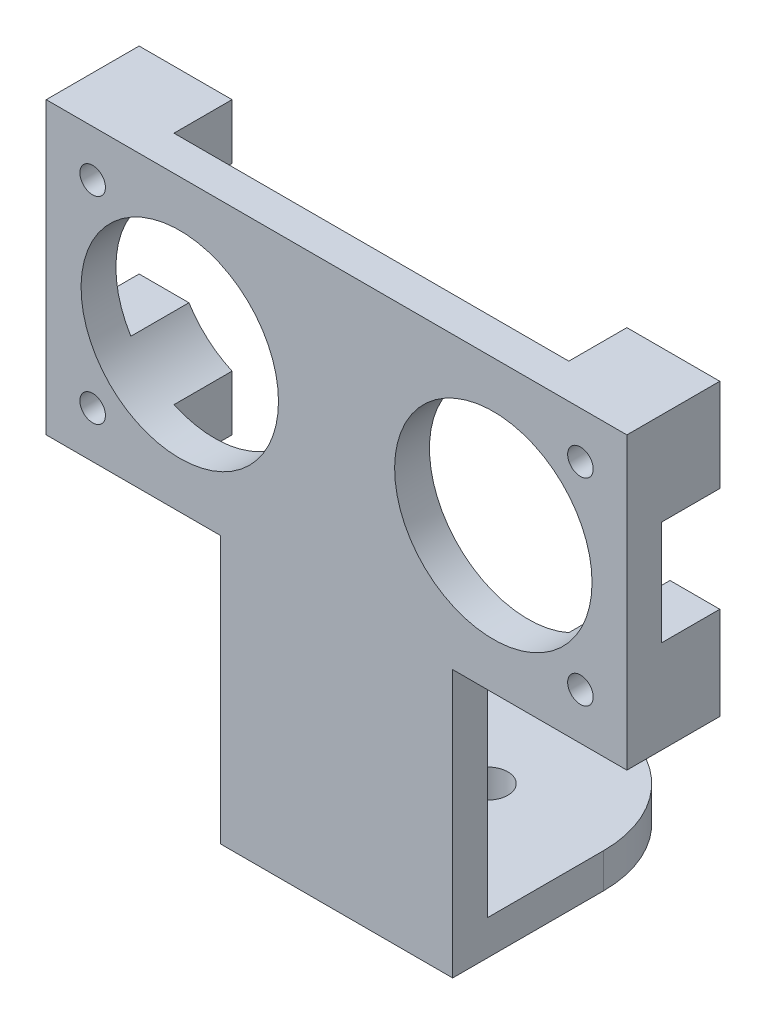
ISO-10303-21;
HEADER;
FILE_DESCRIPTION(('STEP AP214'),'2;1');
FILE_NAME('part.step','',(''),(''),'','','');
FILE_SCHEMA(('AUTOMOTIVE_DESIGN { 1 0 10303 214 1 1 1 1 }'));
ENDSEC;
DATA;
#1=APPLICATION_CONTEXT('core data for automotive mechanical design processes');
#2=APPLICATION_PROTOCOL_DEFINITION('international standard','automotive_design',2000,#1);
#3=PRODUCT_CONTEXT('',#1,'mechanical');
#4=PRODUCT('Part','Part','',(#3));
#5=PRODUCT_RELATED_PRODUCT_CATEGORY('part','',(#4));
#6=PRODUCT_DEFINITION_FORMATION('','',#4);
#7=PRODUCT_DEFINITION_CONTEXT('part definition',#1,'design');
#8=PRODUCT_DEFINITION('design','',#6,#7);
#9=PRODUCT_DEFINITION_SHAPE('','',#8);
#10=(LENGTH_UNIT() NAMED_UNIT(*) SI_UNIT(.MILLI.,.METRE.));
#11=(NAMED_UNIT(*) PLANE_ANGLE_UNIT() SI_UNIT($,.RADIAN.));
#12=(NAMED_UNIT(*) SI_UNIT($,.STERADIAN.) SOLID_ANGLE_UNIT());
#13=UNCERTAINTY_MEASURE_WITH_UNIT(LENGTH_MEASURE(1.E-05),#10,'distance_accuracy_value','');
#14=(GEOMETRIC_REPRESENTATION_CONTEXT(3) GLOBAL_UNCERTAINTY_ASSIGNED_CONTEXT((#13)) GLOBAL_UNIT_ASSIGNED_CONTEXT((#10,
#11,#12)) REPRESENTATION_CONTEXT('',''));
#15=CARTESIAN_POINT('',(0.,0.,0.));
#16=DIRECTION('',(0.,0.,1.));
#17=DIRECTION('',(1.,0.,0.));
#18=AXIS2_PLACEMENT_3D('',#15,#16,#17);
#19=CARTESIAN_POINT('',(0.,0.,0.));
#20=DIRECTION('',(0.,0.,-1.));
#21=DIRECTION('',(-1.,0.,0.));
#22=AXIS2_PLACEMENT_3D('',#19,#20,#21);
#23=PLANE('',#22);
#24=DIRECTION('',(1.,0.,0.));
#25=VECTOR('',#24,1.);
#26=CARTESIAN_POINT('',(-25.,-12.5,0.));
#27=LINE('',#26,#25);
#28=CARTESIAN_POINT('',(-17.,-12.5,0.));
#29=VERTEX_POINT('',#28);
#30=CARTESIAN_POINT('',(-9.99999999999999,-12.5,0.));
#31=VERTEX_POINT('',#30);
#32=EDGE_CURVE('E58',#29,#31,#27,.T.);
#33=ORIENTED_EDGE('',*,*,#32,.F.);
#34=DIRECTION('',(0.,-1.,0.));
#35=VECTOR('',#34,1.);
#36=CARTESIAN_POINT('',(-17.,-12.5,0.));
#37=LINE('',#36,#35);
#38=CARTESIAN_POINT('',(-17.,-7.74596669241484,0.));
#39=VERTEX_POINT('',#38);
#40=EDGE_CURVE('E779',#39,#29,#37,.T.);
#41=ORIENTED_EDGE('',*,*,#40,.F.);
#42=CARTESIAN_POINT('',(-13.5,0.,0.));
#43=DIRECTION('',(0.,0.,1.));
#44=DIRECTION('',(1.,0.,0.));
#45=AXIS2_PLACEMENT_3D('',#42,#43,#44);
#46=CIRCLE('',#45,8.5);
#47=CARTESIAN_POINT('',(-17.,7.74596669241483,0.));
#48=VERTEX_POINT('',#47);
#49=EDGE_CURVE('E232',#39,#48,#46,.T.);
#50=ORIENTED_EDGE('',*,*,#49,.T.);
#51=DIRECTION('',(0.,-1.,0.));
#52=VECTOR('',#51,1.);
#53=CARTESIAN_POINT('',(-17.,12.5,0.));
#54=LINE('',#53,#52);
#55=CARTESIAN_POINT('',(-17.,12.5,0.));
#56=VERTEX_POINT('',#55);
#57=EDGE_CURVE('E312',#56,#48,#54,.T.);
#58=ORIENTED_EDGE('',*,*,#57,.F.);
#59=DIRECTION('',(-1.,0.,0.));
#60=VECTOR('',#59,1.);
#61=CARTESIAN_POINT('',(-25.,12.5,0.));
#62=LINE('',#61,#60);
#63=CARTESIAN_POINT('',(17.,12.5,0.));
#64=VERTEX_POINT('',#63);
#65=EDGE_CURVE('E410',#64,#56,#62,.T.);
#66=ORIENTED_EDGE('',*,*,#65,.F.);
#67=DIRECTION('',(0.,1.,0.));
#68=VECTOR('',#67,1.);
#69=CARTESIAN_POINT('',(17.,12.5,0.));
#70=LINE('',#69,#68);
#71=CARTESIAN_POINT('',(17.,7.74596669241483,0.));
#72=VERTEX_POINT('',#71);
#73=EDGE_CURVE('E274',#72,#64,#70,.T.);
#74=ORIENTED_EDGE('',*,*,#73,.F.);
#75=CARTESIAN_POINT('',(13.5,0.,0.));
#76=DIRECTION('',(0.,0.,1.));
#77=DIRECTION('',(1.,0.,0.));
#78=AXIS2_PLACEMENT_3D('',#75,#76,#77);
#79=CIRCLE('',#78,8.5);
#80=CARTESIAN_POINT('',(17.,-7.74596669241483,0.));
#81=VERTEX_POINT('',#80);
#82=EDGE_CURVE('E381',#72,#81,#79,.T.);
#83=ORIENTED_EDGE('',*,*,#82,.T.);
#84=DIRECTION('',(0.,1.,0.));
#85=VECTOR('',#84,1.);
#86=CARTESIAN_POINT('',(17.,-12.5,0.));
#87=LINE('',#86,#85);
#88=CARTESIAN_POINT('',(17.,-12.5,0.));
#89=VERTEX_POINT('',#88);
#90=EDGE_CURVE('E246',#89,#81,#87,.T.);
#91=ORIENTED_EDGE('',*,*,#90,.F.);
#92=DIRECTION('',(1.,0.,0.));
#93=VECTOR('',#92,1.);
#94=CARTESIAN_POINT('',(10.,-12.5,0.));
#95=LINE('',#94,#93);
#96=CARTESIAN_POINT('',(10.,-12.5,0.));
#97=VERTEX_POINT('',#96);
#98=EDGE_CURVE('E386',#97,#89,#95,.T.);
#99=ORIENTED_EDGE('',*,*,#98,.F.);
#100=DIRECTION('',(0.,1.,0.));
#101=VECTOR('',#100,1.);
#102=CARTESIAN_POINT('',(10.,-32.5,0.));
#103=LINE('',#102,#101);
#104=CARTESIAN_POINT('',(9.99999999999998,-32.5,0.));
#105=VERTEX_POINT('',#104);
#106=EDGE_CURVE('E393',#105,#97,#103,.T.);
#107=ORIENTED_EDGE('',*,*,#106,.F.);
#108=DIRECTION('',(1.,0.,0.));
#109=VECTOR('',#108,1.);
#110=CARTESIAN_POINT('',(-10.,-32.5,0.));
#111=LINE('',#110,#109);
#112=CARTESIAN_POINT('',(-10.,-32.5,0.));
#113=VERTEX_POINT('',#112);
#114=EDGE_CURVE('E417',#113,#105,#111,.T.);
#115=ORIENTED_EDGE('',*,*,#114,.F.);
#116=DIRECTION('',(0.,-1.,0.));
#117=VECTOR('',#116,1.);
#118=CARTESIAN_POINT('',(-9.99999999999999,-12.5,0.));
#119=LINE('',#118,#117);
#120=EDGE_CURVE('E415',#31,#113,#119,.T.);
#121=ORIENTED_EDGE('',*,*,#120,.F.);
#122=EDGE_LOOP('',(#33,#41,#50,#58,#66,#74,#83,#91,#99,#107,#115,#121));
#123=FACE_BOUND('',#122,.T.);
#124=ADVANCED_FACE('F35',(#123),#23,.T.);
#125=CARTESIAN_POINT('',(-20.711102550928,4.5,0.));
#126=VERTEX_POINT('',#125);
#127=CARTESIAN_POINT('',(-20.711102550928,-4.5,0.));
#128=VERTEX_POINT('',#127);
#129=EDGE_CURVE('E387',#126,#128,#46,.T.);
#130=ORIENTED_EDGE('',*,*,#129,.T.);
#131=DIRECTION('',(1.,0.,0.));
#132=VECTOR('',#131,1.);
#133=CARTESIAN_POINT('',(-25.,-4.5,0.));
#134=LINE('',#133,#132);
#135=CARTESIAN_POINT('',(-25.,-4.49999999999999,0.));
#136=VERTEX_POINT('',#135);
#137=EDGE_CURVE('E50',#136,#128,#134,.T.);
#138=ORIENTED_EDGE('',*,*,#137,.F.);
#139=DIRECTION('',(0.,-1.,0.));
#140=VECTOR('',#139,1.);
#141=CARTESIAN_POINT('',(-25.,12.5,0.));
#142=LINE('',#141,#140);
#143=CARTESIAN_POINT('',(-25.,4.5,0.));
#144=VERTEX_POINT('',#143);
#145=EDGE_CURVE('E412',#144,#136,#142,.T.);
#146=ORIENTED_EDGE('',*,*,#145,.F.);
#147=DIRECTION('',(-1.,0.,0.));
#148=VECTOR('',#147,1.);
#149=CARTESIAN_POINT('',(-25.,4.5,0.));
#150=LINE('',#149,#148);
#151=EDGE_CURVE('E307',#126,#144,#150,.T.);
#152=ORIENTED_EDGE('',*,*,#151,.F.);
#153=EDGE_LOOP('',(#130,#138,#146,#152));
#154=FACE_BOUND('',#153,.T.);
#155=ADVANCED_FACE('F501',(#154),#23,.T.);
#156=DIRECTION('',(0.,1.,0.));
#157=VECTOR('',#156,1.);
#158=CARTESIAN_POINT('',(25.,12.5,0.));
#159=LINE('',#158,#157);
#160=CARTESIAN_POINT('',(25.,-4.5,0.));
#161=VERTEX_POINT('',#160);
#162=CARTESIAN_POINT('',(25.,4.5,0.));
#163=VERTEX_POINT('',#162);
#164=EDGE_CURVE('E408',#161,#163,#159,.T.);
#165=ORIENTED_EDGE('',*,*,#164,.F.);
#166=DIRECTION('',(1.,0.,0.));
#167=VECTOR('',#166,1.);
#168=CARTESIAN_POINT('',(25.,-4.5,0.));
#169=LINE('',#168,#167);
#170=CARTESIAN_POINT('',(20.711102550928,-4.5,0.));
#171=VERTEX_POINT('',#170);
#172=EDGE_CURVE('E236',#171,#161,#169,.T.);
#173=ORIENTED_EDGE('',*,*,#172,.F.);
#174=CARTESIAN_POINT('',(20.711102550928,4.5,0.));
#175=VERTEX_POINT('',#174);
#176=EDGE_CURVE('E377',#171,#175,#79,.T.);
#177=ORIENTED_EDGE('',*,*,#176,.T.);
#178=DIRECTION('',(-1.,0.,0.));
#179=VECTOR('',#178,1.);
#180=CARTESIAN_POINT('',(25.,4.5,0.));
#181=LINE('',#180,#179);
#182=EDGE_CURVE('E279',#163,#175,#181,.T.);
#183=ORIENTED_EDGE('',*,*,#182,.F.);
#184=EDGE_LOOP('',(#165,#173,#177,#183));
#185=FACE_BOUND('',#184,.T.);
#186=ADVANCED_FACE('F499',(#185),#23,.T.);
#187=CARTESIAN_POINT('',(0.,0.,3.));
#188=DIRECTION('',(0.,0.,-1.));
#189=DIRECTION('',(-1.,0.,0.));
#190=AXIS2_PLACEMENT_3D('',#187,#188,#189);
#191=PLANE('',#190);
#192=DIRECTION('',(1.,0.,0.));
#193=VECTOR('',#192,1.);
#194=CARTESIAN_POINT('',(10.,-12.5,3.));
#195=LINE('',#194,#193);
#196=CARTESIAN_POINT('',(10.,-12.5,3.));
#197=VERTEX_POINT('',#196);
#198=CARTESIAN_POINT('',(25.,-12.5,3.));
#199=VERTEX_POINT('',#198);
#200=EDGE_CURVE('E389',#197,#199,#195,.T.);
#201=ORIENTED_EDGE('',*,*,#200,.T.);
#202=DIRECTION('',(0.,1.,0.));
#203=VECTOR('',#202,1.);
#204=CARTESIAN_POINT('',(25.,12.5,3.));
#205=LINE('',#204,#203);
#206=CARTESIAN_POINT('',(25.,12.5,3.));
#207=VERTEX_POINT('',#206);
#208=EDGE_CURVE('E392',#199,#207,#205,.T.);
#209=ORIENTED_EDGE('',*,*,#208,.T.);
#210=DIRECTION('',(-1.,0.,0.));
#211=VECTOR('',#210,1.);
#212=CARTESIAN_POINT('',(-25.,12.5,3.));
#213=LINE('',#212,#211);
#214=CARTESIAN_POINT('',(-25.,12.5,3.));
#215=VERTEX_POINT('',#214);
#216=EDGE_CURVE('E395',#207,#215,#213,.T.);
#217=ORIENTED_EDGE('',*,*,#216,.T.);
#218=DIRECTION('',(0.,-1.,0.));
#219=VECTOR('',#218,1.);
#220=CARTESIAN_POINT('',(-25.,12.5,3.));
#221=LINE('',#220,#219);
#222=CARTESIAN_POINT('',(-25.,-12.5,3.));
#223=VERTEX_POINT('',#222);
#224=EDGE_CURVE('E397',#215,#223,#221,.T.);
#225=ORIENTED_EDGE('',*,*,#224,.T.);
#226=DIRECTION('',(1.,0.,0.));
#227=VECTOR('',#226,1.);
#228=CARTESIAN_POINT('',(-25.,-12.5,3.));
#229=LINE('',#228,#227);
#230=CARTESIAN_POINT('',(-9.99999999999999,-12.5,3.));
#231=VERTEX_POINT('',#230);
#232=EDGE_CURVE('E399',#223,#231,#229,.T.);
#233=ORIENTED_EDGE('',*,*,#232,.T.);
#234=DIRECTION('',(0.,-1.,0.));
#235=VECTOR('',#234,1.);
#236=CARTESIAN_POINT('',(-9.99999999999999,-12.5,3.));
#237=LINE('',#236,#235);
#238=CARTESIAN_POINT('',(-9.99999999999999,-35.5,3.));
#239=VERTEX_POINT('',#238);
#240=EDGE_CURVE('E401',#231,#239,#237,.T.);
#241=ORIENTED_EDGE('',*,*,#240,.T.);
#242=DIRECTION('',(-1.,0.,0.));
#243=VECTOR('',#242,1.);
#244=CARTESIAN_POINT('',(-9.99999999999999,-35.5,3.));
#245=LINE('',#244,#243);
#246=CARTESIAN_POINT('',(9.99999999999998,-35.5,3.));
#247=VERTEX_POINT('',#246);
#248=EDGE_CURVE('E343',#247,#239,#245,.T.);
#249=ORIENTED_EDGE('',*,*,#248,.F.);
#250=DIRECTION('',(0.,1.,0.));
#251=VECTOR('',#250,1.);
#252=CARTESIAN_POINT('',(10.,-32.5,3.));
#253=LINE('',#252,#251);
#254=EDGE_CURVE('E403',#247,#197,#253,.T.);
#255=ORIENTED_EDGE('',*,*,#254,.T.);
#256=EDGE_LOOP('',(#201,#209,#217,#225,#233,#241,#249,#255));
#257=FACE_BOUND('',#256,.T.);
#258=CARTESIAN_POINT('',(-13.5,0.,3.));
#259=DIRECTION('',(0.,0.,1.));
#260=DIRECTION('',(1.,0.,0.));
#261=AXIS2_PLACEMENT_3D('',#258,#259,#260);
#262=CIRCLE('',#261,8.5);
#263=CARTESIAN_POINT('',(-4.99999999999999,0.,3.));
#264=VERTEX_POINT('',#263);
#265=EDGE_CURVE('E383',#264,#264,#262,.T.);
#266=ORIENTED_EDGE('',*,*,#265,.F.);
#267=EDGE_LOOP('',(#266));
#268=FACE_BOUND('',#267,.T.);
#269=CARTESIAN_POINT('',(13.5,0.,3.));
#270=DIRECTION('',(0.,0.,1.));
#271=DIRECTION('',(1.,0.,0.));
#272=AXIS2_PLACEMENT_3D('',#269,#270,#271);
#273=CIRCLE('',#272,8.5);
#274=CARTESIAN_POINT('',(22.,0.,3.));
#275=VERTEX_POINT('',#274);
#276=EDGE_CURVE('E378',#275,#275,#273,.T.);
#277=ORIENTED_EDGE('',*,*,#276,.F.);
#278=EDGE_LOOP('',(#277));
#279=FACE_BOUND('',#278,.T.);
#280=CARTESIAN_POINT('',(-21.,8.5,3.));
#281=DIRECTION('',(0.,0.,1.));
#282=DIRECTION('',(1.,0.,0.));
#283=AXIS2_PLACEMENT_3D('',#280,#281,#282);
#284=CIRCLE('',#283,1.1);
#285=CARTESIAN_POINT('',(-19.9,8.5,3.));
#286=VERTEX_POINT('',#285);
#287=EDGE_CURVE('E374',#286,#286,#284,.T.);
#288=ORIENTED_EDGE('',*,*,#287,.F.);
#289=EDGE_LOOP('',(#288));
#290=FACE_BOUND('',#289,.T.);
#291=CARTESIAN_POINT('',(21.,8.5,3.));
#292=DIRECTION('',(0.,0.,1.));
#293=DIRECTION('',(1.,0.,0.));
#294=AXIS2_PLACEMENT_3D('',#291,#292,#293);
#295=CIRCLE('',#294,1.1);
#296=CARTESIAN_POINT('',(22.1,8.5,3.));
#297=VERTEX_POINT('',#296);
#298=EDGE_CURVE('E371',#297,#297,#295,.T.);
#299=ORIENTED_EDGE('',*,*,#298,.F.);
#300=EDGE_LOOP('',(#299));
#301=FACE_BOUND('',#300,.T.);
#302=CARTESIAN_POINT('',(21.,-8.5,3.));
#303=DIRECTION('',(0.,0.,1.));
#304=DIRECTION('',(1.,0.,0.));
#305=AXIS2_PLACEMENT_3D('',#302,#303,#304);
#306=CIRCLE('',#305,1.1);
#307=CARTESIAN_POINT('',(22.1,-8.5,3.));
#308=VERTEX_POINT('',#307);
#309=EDGE_CURVE('E368',#308,#308,#306,.T.);
#310=ORIENTED_EDGE('',*,*,#309,.F.);
#311=EDGE_LOOP('',(#310));
#312=FACE_BOUND('',#311,.T.);
#313=CARTESIAN_POINT('',(-21.,-8.5,3.));
#314=DIRECTION('',(0.,0.,1.));
#315=DIRECTION('',(1.,0.,0.));
#316=AXIS2_PLACEMENT_3D('',#313,#314,#315);
#317=CIRCLE('',#316,1.1);
#318=CARTESIAN_POINT('',(-19.9,-8.5,3.));
#319=VERTEX_POINT('',#318);
#320=EDGE_CURVE('E365',#319,#319,#317,.T.);
#321=ORIENTED_EDGE('',*,*,#320,.F.);
#322=EDGE_LOOP('',(#321));
#323=FACE_BOUND('',#322,.T.);
#324=ADVANCED_FACE('F475',(#257,#268,#279,#290,#301,#312,#323),#191,.F.);
#325=CARTESIAN_POINT('',(10.,-12.5,3.));
#326=DIRECTION('',(0.,1.,0.));
#327=DIRECTION('',(-1.,0.,0.));
#328=AXIS2_PLACEMENT_3D('',#325,#326,#327);
#329=PLANE('',#328);
#330=ORIENTED_EDGE('',*,*,#98,.T.);
#331=DIRECTION('',(0.,0.,1.));
#332=VECTOR('',#331,1.);
#333=CARTESIAN_POINT('',(17.,-12.5,-5.));
#334=LINE('',#333,#332);
#335=CARTESIAN_POINT('',(17.,-12.5,-5.));
#336=VERTEX_POINT('',#335);
#337=EDGE_CURVE('E262',#336,#89,#334,.T.);
#338=ORIENTED_EDGE('',*,*,#337,.F.);
#339=DIRECTION('',(-1.,0.,0.));
#340=VECTOR('',#339,1.);
#341=CARTESIAN_POINT('',(25.,-12.5,-5.));
#342=LINE('',#341,#340);
#343=CARTESIAN_POINT('',(25.,-12.5,-5.));
#344=VERTEX_POINT('',#343);
#345=EDGE_CURVE('E251',#344,#336,#342,.T.);
#346=ORIENTED_EDGE('',*,*,#345,.F.);
#347=DIRECTION('',(0.,0.,-1.));
#348=VECTOR('',#347,1.);
#349=CARTESIAN_POINT('',(25.,-12.5,3.));
#350=LINE('',#349,#348);
#351=EDGE_CURVE('E11',#199,#344,#350,.T.);
#352=ORIENTED_EDGE('',*,*,#351,.F.);
#353=ORIENTED_EDGE('',*,*,#200,.F.);
#354=DIRECTION('',(0.,0.,-1.));
#355=VECTOR('',#354,1.);
#356=CARTESIAN_POINT('',(10.,-12.5,3.));
#357=LINE('',#356,#355);
#358=EDGE_CURVE('E405',#197,#97,#357,.T.);
#359=ORIENTED_EDGE('',*,*,#358,.T.);
#360=EDGE_LOOP('',(#330,#338,#346,#352,#353,#359));
#361=FACE_BOUND('',#360,.T.);
#362=ADVANCED_FACE('F37',(#361),#329,.F.);
#363=CARTESIAN_POINT('',(25.,12.5,3.));
#364=DIRECTION('',(-1.,0.,0.));
#365=DIRECTION('',(0.,-1.,0.));
#366=AXIS2_PLACEMENT_3D('',#363,#364,#365);
#367=PLANE('',#366);
#368=ORIENTED_EDGE('',*,*,#351,.T.);
#369=DIRECTION('',(0.,-1.,0.));
#370=VECTOR('',#369,1.);
#371=CARTESIAN_POINT('',(25.,-12.5,-5.));
#372=LINE('',#371,#370);
#373=CARTESIAN_POINT('',(25.,-4.5,-5.));
#374=VERTEX_POINT('',#373);
#375=EDGE_CURVE('E248',#374,#344,#372,.T.);
#376=ORIENTED_EDGE('',*,*,#375,.F.);
#377=DIRECTION('',(0.,0.,1.));
#378=VECTOR('',#377,1.);
#379=CARTESIAN_POINT('',(25.,-4.5,-5.));
#380=LINE('',#379,#378);
#381=EDGE_CURVE('E265',#374,#161,#380,.T.);
#382=ORIENTED_EDGE('',*,*,#381,.T.);
#383=ORIENTED_EDGE('',*,*,#164,.T.);
#384=DIRECTION('',(0.,0.,1.));
#385=VECTOR('',#384,1.);
#386=CARTESIAN_POINT('',(25.,4.5,-5.));
#387=LINE('',#386,#385);
#388=CARTESIAN_POINT('',(25.,4.5,-5.));
#389=VERTEX_POINT('',#388);
#390=EDGE_CURVE('E295',#389,#163,#387,.T.);
#391=ORIENTED_EDGE('',*,*,#390,.F.);
#392=DIRECTION('',(0.,-1.,0.));
#393=VECTOR('',#392,1.);
#394=CARTESIAN_POINT('',(25.,12.5,-5.));
#395=LINE('',#394,#393);
#396=CARTESIAN_POINT('',(25.,12.5,-5.));
#397=VERTEX_POINT('',#396);
#398=EDGE_CURVE('E284',#397,#389,#395,.T.);
#399=ORIENTED_EDGE('',*,*,#398,.F.);
#400=DIRECTION('',(0.,0.,-1.));
#401=VECTOR('',#400,1.);
#402=CARTESIAN_POINT('',(25.,12.5,3.));
#403=LINE('',#402,#401);
#404=EDGE_CURVE('E43',#207,#397,#403,.T.);
#405=ORIENTED_EDGE('',*,*,#404,.F.);
#406=ORIENTED_EDGE('',*,*,#208,.F.);
#407=EDGE_LOOP('',(#368,#376,#382,#383,#391,#399,#405,#406));
#408=FACE_BOUND('',#407,.T.);
#409=ADVANCED_FACE('F442',(#408),#367,.F.);
#410=CARTESIAN_POINT('',(-25.,12.5,3.));
#411=DIRECTION('',(0.,-1.,0.));
#412=DIRECTION('',(1.,0.,0.));
#413=AXIS2_PLACEMENT_3D('',#410,#411,#412);
#414=PLANE('',#413);
#415=ORIENTED_EDGE('',*,*,#404,.T.);
#416=DIRECTION('',(1.,0.,0.));
#417=VECTOR('',#416,1.);
#418=CARTESIAN_POINT('',(25.,12.5,-5.));
#419=LINE('',#418,#417);
#420=CARTESIAN_POINT('',(17.,12.5,-5.));
#421=VERTEX_POINT('',#420);
#422=EDGE_CURVE('E281',#421,#397,#419,.T.);
#423=ORIENTED_EDGE('',*,*,#422,.F.);
#424=DIRECTION('',(0.,0.,1.));
#425=VECTOR('',#424,1.);
#426=CARTESIAN_POINT('',(17.,12.5,-5.));
#427=LINE('',#426,#425);
#428=EDGE_CURVE('E298',#421,#64,#427,.T.);
#429=ORIENTED_EDGE('',*,*,#428,.T.);
#430=ORIENTED_EDGE('',*,*,#65,.T.);
#431=DIRECTION('',(0.,0.,1.));
#432=VECTOR('',#431,1.);
#433=CARTESIAN_POINT('',(-17.,12.5,-5.));
#434=LINE('',#433,#432);
#435=CARTESIAN_POINT('',(-17.,12.5,-5.));
#436=VERTEX_POINT('',#435);
#437=EDGE_CURVE('E327',#436,#56,#434,.T.);
#438=ORIENTED_EDGE('',*,*,#437,.F.);
#439=DIRECTION('',(1.,0.,0.));
#440=VECTOR('',#439,1.);
#441=CARTESIAN_POINT('',(-25.,12.5,-5.));
#442=LINE('',#441,#440);
#443=CARTESIAN_POINT('',(-25.,12.5,-5.));
#444=VERTEX_POINT('',#443);
#445=EDGE_CURVE('E317',#444,#436,#442,.T.);
#446=ORIENTED_EDGE('',*,*,#445,.F.);
#447=DIRECTION('',(0.,0.,-1.));
#448=VECTOR('',#447,1.);
#449=CARTESIAN_POINT('',(-25.,12.5,3.));
#450=LINE('',#449,#448);
#451=EDGE_CURVE('E428',#215,#444,#450,.T.);
#452=ORIENTED_EDGE('',*,*,#451,.F.);
#453=ORIENTED_EDGE('',*,*,#216,.F.);
#454=EDGE_LOOP('',(#415,#423,#429,#430,#438,#446,#452,#453));
#455=FACE_BOUND('',#454,.T.);
#456=ADVANCED_FACE('F433',(#455),#414,.F.);
#457=CARTESIAN_POINT('',(-25.,12.5,3.));
#458=DIRECTION('',(1.,0.,0.));
#459=DIRECTION('',(0.,0.,-1.));
#460=AXIS2_PLACEMENT_3D('',#457,#458,#459);
#461=PLANE('',#460);
#462=ORIENTED_EDGE('',*,*,#451,.T.);
#463=DIRECTION('',(0.,1.,0.));
#464=VECTOR('',#463,1.);
#465=CARTESIAN_POINT('',(-25.,12.5,-5.));
#466=LINE('',#465,#464);
#467=CARTESIAN_POINT('',(-25.,4.5,-5.));
#468=VERTEX_POINT('',#467);
#469=EDGE_CURVE('E314',#468,#444,#466,.T.);
#470=ORIENTED_EDGE('',*,*,#469,.F.);
#471=DIRECTION('',(0.,0.,1.));
#472=VECTOR('',#471,1.);
#473=CARTESIAN_POINT('',(-25.,4.5,-5.));
#474=LINE('',#473,#472);
#475=EDGE_CURVE('E330',#468,#144,#474,.T.);
#476=ORIENTED_EDGE('',*,*,#475,.T.);
#477=ORIENTED_EDGE('',*,*,#145,.T.);
#478=DIRECTION('',(0.,0.,1.));
#479=VECTOR('',#478,1.);
#480=CARTESIAN_POINT('',(-25.,-4.5,-5.));
#481=LINE('',#480,#479);
#482=CARTESIAN_POINT('',(-25.,-4.5,-5.));
#483=VERTEX_POINT('',#482);
#484=EDGE_CURVE('E238',#483,#136,#481,.T.);
#485=ORIENTED_EDGE('',*,*,#484,.F.);
#486=DIRECTION('',(0.,1.,0.));
#487=VECTOR('',#486,1.);
#488=CARTESIAN_POINT('',(-25.,-12.5,-5.));
#489=LINE('',#488,#487);
#490=CARTESIAN_POINT('',(-25.,-12.5,-5.));
#491=VERTEX_POINT('',#490);
#492=EDGE_CURVE('E773',#491,#483,#489,.T.);
#493=ORIENTED_EDGE('',*,*,#492,.F.);
#494=DIRECTION('',(0.,0.,-1.));
#495=VECTOR('',#494,1.);
#496=CARTESIAN_POINT('',(-25.,-12.5,3.));
#497=LINE('',#496,#495);
#498=EDGE_CURVE('E426',#223,#491,#497,.T.);
#499=ORIENTED_EDGE('',*,*,#498,.F.);
#500=ORIENTED_EDGE('',*,*,#224,.F.);
#501=EDGE_LOOP('',(#462,#470,#476,#477,#485,#493,#499,#500));
#502=FACE_BOUND('',#501,.T.);
#503=ADVANCED_FACE('F471',(#502),#461,.F.);
#504=CARTESIAN_POINT('',(-25.,-12.5,3.));
#505=DIRECTION('',(0.,1.,0.));
#506=DIRECTION('',(0.,0.,1.));
#507=AXIS2_PLACEMENT_3D('',#504,#505,#506);
#508=PLANE('',#507);
#509=ORIENTED_EDGE('',*,*,#498,.T.);
#510=DIRECTION('',(-1.,0.,0.));
#511=VECTOR('',#510,1.);
#512=CARTESIAN_POINT('',(-25.,-12.5,-5.));
#513=LINE('',#512,#511);
#514=CARTESIAN_POINT('',(-17.,-12.5,-5.));
#515=VERTEX_POINT('',#514);
#516=EDGE_CURVE('E218',#515,#491,#513,.T.);
#517=ORIENTED_EDGE('',*,*,#516,.F.);
#518=DIRECTION('',(0.,0.,1.));
#519=VECTOR('',#518,1.);
#520=CARTESIAN_POINT('',(-17.,-12.5,-5.));
#521=LINE('',#520,#519);
#522=EDGE_CURVE('E214',#515,#29,#521,.T.);
#523=ORIENTED_EDGE('',*,*,#522,.T.);
#524=ORIENTED_EDGE('',*,*,#32,.T.);
#525=DIRECTION('',(0.,0.,-1.));
#526=VECTOR('',#525,1.);
#527=CARTESIAN_POINT('',(-9.99999999999999,-12.5,3.));
#528=LINE('',#527,#526);
#529=EDGE_CURVE('E423',#231,#31,#528,.T.);
#530=ORIENTED_EDGE('',*,*,#529,.F.);
#531=ORIENTED_EDGE('',*,*,#232,.F.);
#532=EDGE_LOOP('',(#509,#517,#523,#524,#530,#531));
#533=FACE_BOUND('',#532,.T.);
#534=ADVANCED_FACE('F557',(#533),#508,.F.);
#535=CARTESIAN_POINT('',(-9.99999999999999,-12.5,3.));
#536=DIRECTION('',(1.,0.,0.));
#537=DIRECTION('',(0.,1.,0.));
#538=AXIS2_PLACEMENT_3D('',#535,#536,#537);
#539=PLANE('',#538);
#540=ORIENTED_EDGE('',*,*,#120,.T.);
#541=DIRECTION('',(0.,0.,-1.));
#542=VECTOR('',#541,1.);
#543=CARTESIAN_POINT('',(-10.,-32.5,3.));
#544=LINE('',#543,#542);
#545=CARTESIAN_POINT('',(-10.,-32.5,-10.));
#546=VERTEX_POINT('',#545);
#547=EDGE_CURVE('E340',#113,#546,#544,.T.);
#548=ORIENTED_EDGE('',*,*,#547,.T.);
#549=DIRECTION('',(0.,1.,0.));
#550=VECTOR('',#549,1.);
#551=CARTESIAN_POINT('',(-9.99999999999999,-35.5,-10.));
#552=LINE('',#551,#550);
#553=CARTESIAN_POINT('',(-9.99999999999999,-35.5,-10.));
#554=VERTEX_POINT('',#553);
#555=EDGE_CURVE('E362',#554,#546,#552,.T.);
#556=ORIENTED_EDGE('',*,*,#555,.F.);
#557=DIRECTION('',(0.,0.,-1.));
#558=VECTOR('',#557,1.);
#559=CARTESIAN_POINT('',(-9.99999999999999,-35.5,3.));
#560=LINE('',#559,#558);
#561=EDGE_CURVE('E346',#239,#554,#560,.T.);
#562=ORIENTED_EDGE('',*,*,#561,.F.);
#563=ORIENTED_EDGE('',*,*,#240,.F.);
#564=ORIENTED_EDGE('',*,*,#529,.T.);
#565=EDGE_LOOP('',(#540,#548,#556,#562,#563,#564));
#566=FACE_BOUND('',#565,.T.);
#567=ADVANCED_FACE('F566',(#566),#539,.F.);
#568=CARTESIAN_POINT('',(10.,-32.5,3.));
#569=DIRECTION('',(-1.,0.,0.));
#570=DIRECTION('',(0.,-1.,0.));
#571=AXIS2_PLACEMENT_3D('',#568,#569,#570);
#572=PLANE('',#571);
#573=ORIENTED_EDGE('',*,*,#106,.T.);
#574=ORIENTED_EDGE('',*,*,#358,.F.);
#575=ORIENTED_EDGE('',*,*,#254,.F.);
#576=DIRECTION('',(0.,0.,1.));
#577=VECTOR('',#576,1.);
#578=CARTESIAN_POINT('',(9.99999999999998,-35.5,3.));
#579=LINE('',#578,#577);
#580=CARTESIAN_POINT('',(9.99999999999999,-35.5,-10.));
#581=VERTEX_POINT('',#580);
#582=EDGE_CURVE('E351',#581,#247,#579,.T.);
#583=ORIENTED_EDGE('',*,*,#582,.F.);
#584=DIRECTION('',(0.,1.,0.));
#585=VECTOR('',#584,1.);
#586=CARTESIAN_POINT('',(9.99999999999999,-35.5,-10.));
#587=LINE('',#586,#585);
#588=CARTESIAN_POINT('',(9.99999999999999,-32.5,-10.));
#589=VERTEX_POINT('',#588);
#590=EDGE_CURVE('E354',#581,#589,#587,.T.);
#591=ORIENTED_EDGE('',*,*,#590,.T.);
#592=DIRECTION('',(0.,0.,1.));
#593=VECTOR('',#592,1.);
#594=CARTESIAN_POINT('',(9.99999999999998,-32.5,3.));
#595=LINE('',#594,#593);
#596=EDGE_CURVE('E347',#589,#105,#595,.T.);
#597=ORIENTED_EDGE('',*,*,#596,.T.);
#598=EDGE_LOOP('',(#573,#574,#575,#583,#591,#597));
#599=FACE_BOUND('',#598,.T.);
#600=ADVANCED_FACE('F579',(#599),#572,.F.);
#601=CARTESIAN_POINT('',(-13.5,0.,3.));
#602=DIRECTION('',(0.,0.,-1.));
#603=DIRECTION('',(-1.,0.,0.));
#604=AXIS2_PLACEMENT_3D('',#601,#602,#603);
#605=CYLINDRICAL_SURFACE('',#604,8.5);
#606=ORIENTED_EDGE('',*,*,#265,.T.);
#607=EDGE_LOOP('',(#606));
#608=FACE_BOUND('',#607,.T.);
#609=ORIENTED_EDGE('',*,*,#129,.F.);
#610=DIRECTION('',(0.,0.,1.));
#611=VECTOR('',#610,1.);
#612=CARTESIAN_POINT('',(-20.711102550928,4.5,-5.));
#613=LINE('',#612,#611);
#614=CARTESIAN_POINT('',(-20.711102550928,4.5,-5.));
#615=VERTEX_POINT('',#614);
#616=EDGE_CURVE('E333',#615,#126,#613,.T.);
#617=ORIENTED_EDGE('',*,*,#616,.F.);
#618=CARTESIAN_POINT('',(-13.5,0.,-5.));
#619=DIRECTION('',(0.,0.,1.));
#620=DIRECTION('',(-1.,0.,0.));
#621=AXIS2_PLACEMENT_3D('',#618,#619,#620);
#622=CIRCLE('',#621,8.5);
#623=CARTESIAN_POINT('',(-17.,7.74596669241483,-5.));
#624=VERTEX_POINT('',#623);
#625=EDGE_CURVE('E308',#624,#615,#622,.T.);
#626=ORIENTED_EDGE('',*,*,#625,.F.);
#627=DIRECTION('',(0.,0.,1.));
#628=VECTOR('',#627,1.);
#629=CARTESIAN_POINT('',(-17.,7.74596669241483,-5.));
#630=LINE('',#629,#628);
#631=EDGE_CURVE('E321',#624,#48,#630,.T.);
#632=ORIENTED_EDGE('',*,*,#631,.T.);
#633=ORIENTED_EDGE('',*,*,#49,.F.);
#634=DIRECTION('',(0.,0.,1.));
#635=VECTOR('',#634,1.);
#636=CARTESIAN_POINT('',(-17.,-7.74596669241484,-5.));
#637=LINE('',#636,#635);
#638=CARTESIAN_POINT('',(-17.,-7.74596669241484,-5.));
#639=VERTEX_POINT('',#638);
#640=EDGE_CURVE('E212',#639,#39,#637,.T.);
#641=ORIENTED_EDGE('',*,*,#640,.F.);
#642=CARTESIAN_POINT('',(-13.5,0.,-5.));
#643=DIRECTION('',(0.,0.,1.));
#644=DIRECTION('',(-1.,0.,0.));
#645=AXIS2_PLACEMENT_3D('',#642,#643,#644);
#646=CIRCLE('',#645,8.5);
#647=CARTESIAN_POINT('',(-20.711102550928,-4.5,-5.));
#648=VERTEX_POINT('',#647);
#649=EDGE_CURVE('E219',#648,#639,#646,.T.);
#650=ORIENTED_EDGE('',*,*,#649,.F.);
#651=DIRECTION('',(0.,0.,1.));
#652=VECTOR('',#651,1.);
#653=CARTESIAN_POINT('',(-20.711102550928,-4.5,-5.));
#654=LINE('',#653,#652);
#655=EDGE_CURVE('E778',#648,#128,#654,.T.);
#656=ORIENTED_EDGE('',*,*,#655,.T.);
#657=EDGE_LOOP('',(#609,#617,#626,#632,#633,#641,#650,#656));
#658=FACE_BOUND('',#657,.T.);
#659=ADVANCED_FACE('F230',(#608,#658),#605,.F.);
#660=CARTESIAN_POINT('',(13.5,0.,3.));
#661=DIRECTION('',(0.,0.,-1.));
#662=DIRECTION('',(-1.,0.,0.));
#663=AXIS2_PLACEMENT_3D('',#660,#661,#662);
#664=CYLINDRICAL_SURFACE('',#663,8.5);
#665=ORIENTED_EDGE('',*,*,#276,.T.);
#666=EDGE_LOOP('',(#665));
#667=FACE_BOUND('',#666,.T.);
#668=ORIENTED_EDGE('',*,*,#82,.F.);
#669=DIRECTION('',(0.,0.,1.));
#670=VECTOR('',#669,1.);
#671=CARTESIAN_POINT('',(17.,7.74596669241483,-5.));
#672=LINE('',#671,#670);
#673=CARTESIAN_POINT('',(17.,7.74596669241483,-5.));
#674=VERTEX_POINT('',#673);
#675=EDGE_CURVE('E301',#674,#72,#672,.T.);
#676=ORIENTED_EDGE('',*,*,#675,.F.);
#677=CARTESIAN_POINT('',(13.5,0.,-5.));
#678=DIRECTION('',(0.,0.,1.));
#679=DIRECTION('',(-1.,0.,0.));
#680=AXIS2_PLACEMENT_3D('',#677,#678,#679);
#681=CIRCLE('',#680,8.5);
#682=CARTESIAN_POINT('',(20.711102550928,4.5,-5.));
#683=VERTEX_POINT('',#682);
#684=EDGE_CURVE('E275',#683,#674,#681,.T.);
#685=ORIENTED_EDGE('',*,*,#684,.F.);
#686=DIRECTION('',(0.,0.,1.));
#687=VECTOR('',#686,1.);
#688=CARTESIAN_POINT('',(20.711102550928,4.5,-5.));
#689=LINE('',#688,#687);
#690=EDGE_CURVE('E288',#683,#175,#689,.T.);
#691=ORIENTED_EDGE('',*,*,#690,.T.);
#692=ORIENTED_EDGE('',*,*,#176,.F.);
#693=DIRECTION('',(0.,0.,1.));
#694=VECTOR('',#693,1.);
#695=CARTESIAN_POINT('',(20.711102550928,-4.5,-5.));
#696=LINE('',#695,#694);
#697=CARTESIAN_POINT('',(20.711102550928,-4.5,-5.));
#698=VERTEX_POINT('',#697);
#699=EDGE_CURVE('E268',#698,#171,#696,.T.);
#700=ORIENTED_EDGE('',*,*,#699,.F.);
#701=CARTESIAN_POINT('',(13.5,0.,-5.));
#702=DIRECTION('',(0.,0.,1.));
#703=DIRECTION('',(-1.,0.,0.));
#704=AXIS2_PLACEMENT_3D('',#701,#702,#703);
#705=CIRCLE('',#704,8.5);
#706=CARTESIAN_POINT('',(17.,-7.74596669241483,-5.));
#707=VERTEX_POINT('',#706);
#708=EDGE_CURVE('E242',#707,#698,#705,.T.);
#709=ORIENTED_EDGE('',*,*,#708,.F.);
#710=DIRECTION('',(0.,0.,1.));
#711=VECTOR('',#710,1.);
#712=CARTESIAN_POINT('',(17.,-7.74596669241483,-5.));
#713=LINE('',#712,#711);
#714=EDGE_CURVE('E255',#707,#81,#713,.T.);
#715=ORIENTED_EDGE('',*,*,#714,.T.);
#716=EDGE_LOOP('',(#668,#676,#685,#691,#692,#700,#709,#715));
#717=FACE_BOUND('',#716,.T.);
#718=ADVANCED_FACE('F451',(#667,#717),#664,.F.);
#719=CARTESIAN_POINT('',(-21.,8.5,3.));
#720=DIRECTION('',(0.,0.,-1.));
#721=DIRECTION('',(-1.,0.,0.));
#722=AXIS2_PLACEMENT_3D('',#719,#720,#721);
#723=CYLINDRICAL_SURFACE('',#722,1.1);
#724=ORIENTED_EDGE('',*,*,#287,.T.);
#725=EDGE_LOOP('',(#724));
#726=FACE_BOUND('',#725,.T.);
#727=CARTESIAN_POINT('',(-21.,8.5,-5.));
#728=DIRECTION('',(0.,0.,-1.));
#729=DIRECTION('',(-1.,0.,0.));
#730=AXIS2_PLACEMENT_3D('',#727,#728,#729);
#731=CIRCLE('',#730,1.1);
#732=CARTESIAN_POINT('',(-22.1,8.5,-5.));
#733=VERTEX_POINT('',#732);
#734=EDGE_CURVE('E304',#733,#733,#731,.T.);
#735=ORIENTED_EDGE('',*,*,#734,.T.);
#736=EDGE_LOOP('',(#735));
#737=FACE_BOUND('',#736,.T.);
#738=ADVANCED_FACE('F591',(#726,#737),#723,.F.);
#739=CARTESIAN_POINT('',(21.,8.5,3.));
#740=DIRECTION('',(0.,0.,-1.));
#741=DIRECTION('',(-1.,0.,0.));
#742=AXIS2_PLACEMENT_3D('',#739,#740,#741);
#743=CYLINDRICAL_SURFACE('',#742,1.1);
#744=ORIENTED_EDGE('',*,*,#298,.T.);
#745=EDGE_LOOP('',(#744));
#746=FACE_BOUND('',#745,.T.);
#747=CARTESIAN_POINT('',(21.,8.5,-5.));
#748=DIRECTION('',(0.,0.,-1.));
#749=DIRECTION('',(-1.,0.,0.));
#750=AXIS2_PLACEMENT_3D('',#747,#748,#749);
#751=CIRCLE('',#750,1.1);
#752=CARTESIAN_POINT('',(19.9,8.5,-5.));
#753=VERTEX_POINT('',#752);
#754=EDGE_CURVE('E271',#753,#753,#751,.T.);
#755=ORIENTED_EDGE('',*,*,#754,.T.);
#756=EDGE_LOOP('',(#755));
#757=FACE_BOUND('',#756,.T.);
#758=ADVANCED_FACE('F601',(#746,#757),#743,.F.);
#759=CARTESIAN_POINT('',(21.,-8.5,3.));
#760=DIRECTION('',(0.,0.,-1.));
#761=DIRECTION('',(-1.,0.,0.));
#762=AXIS2_PLACEMENT_3D('',#759,#760,#761);
#763=CYLINDRICAL_SURFACE('',#762,1.1);
#764=ORIENTED_EDGE('',*,*,#309,.T.);
#765=EDGE_LOOP('',(#764));
#766=FACE_BOUND('',#765,.T.);
#767=CARTESIAN_POINT('',(21.,-8.5,-5.));
#768=DIRECTION('',(0.,0.,-1.));
#769=DIRECTION('',(-1.,0.,0.));
#770=AXIS2_PLACEMENT_3D('',#767,#768,#769);
#771=CIRCLE('',#770,1.1);
#772=CARTESIAN_POINT('',(19.9,-8.5,-5.));
#773=VERTEX_POINT('',#772);
#774=EDGE_CURVE('E233',#773,#773,#771,.T.);
#775=ORIENTED_EDGE('',*,*,#774,.T.);
#776=EDGE_LOOP('',(#775));
#777=FACE_BOUND('',#776,.T.);
#778=ADVANCED_FACE('F612',(#766,#777),#763,.F.);
#779=CARTESIAN_POINT('',(-21.,-8.5,3.));
#780=DIRECTION('',(0.,0.,-1.));
#781=DIRECTION('',(-1.,0.,0.));
#782=AXIS2_PLACEMENT_3D('',#779,#780,#781);
#783=CYLINDRICAL_SURFACE('',#782,1.1);
#784=ORIENTED_EDGE('',*,*,#320,.T.);
#785=EDGE_LOOP('',(#784));
#786=FACE_BOUND('',#785,.T.);
#787=CARTESIAN_POINT('',(-21.,-8.5,-5.));
#788=DIRECTION('',(0.,0.,-1.));
#789=DIRECTION('',(-1.,0.,0.));
#790=AXIS2_PLACEMENT_3D('',#787,#788,#789);
#791=CIRCLE('',#790,1.1);
#792=CARTESIAN_POINT('',(-22.1,-8.5,-5.));
#793=VERTEX_POINT('',#792);
#794=EDGE_CURVE('E781',#793,#793,#791,.T.);
#795=ORIENTED_EDGE('',*,*,#794,.T.);
#796=EDGE_LOOP('',(#795));
#797=FACE_BOUND('',#796,.T.);
#798=ADVANCED_FACE('F623',(#786,#797),#783,.F.);
#799=CARTESIAN_POINT('',(0.,-32.5,-10.));
#800=DIRECTION('',(0.,-1.,0.));
#801=DIRECTION('',(1.,0.,0.));
#802=AXIS2_PLACEMENT_3D('',#799,#800,#801);
#803=PLANE('',#802);
#804=CARTESIAN_POINT('',(0.,-32.5,-10.));
#805=DIRECTION('',(0.,-1.,0.));
#806=DIRECTION('',(1.,0.,0.));
#807=AXIS2_PLACEMENT_3D('',#804,#805,#806);
#808=CIRCLE('',#807,1.75);
#809=CARTESIAN_POINT('',(1.75,-32.5,-10.));
#810=VERTEX_POINT('',#809);
#811=EDGE_CURVE('E336',#810,#810,#808,.T.);
#812=ORIENTED_EDGE('',*,*,#811,.T.);
#813=EDGE_LOOP('',(#812));
#814=FACE_BOUND('',#813,.T.);
#815=ORIENTED_EDGE('',*,*,#547,.F.);
#816=ORIENTED_EDGE('',*,*,#114,.T.);
#817=ORIENTED_EDGE('',*,*,#596,.F.);
#818=CARTESIAN_POINT('',(0.,-32.5,-10.));
#819=DIRECTION('',(0.,-1.,0.));
#820=DIRECTION('',(1.,0.,0.));
#821=AXIS2_PLACEMENT_3D('',#818,#819,#820);
#822=CIRCLE('',#821,9.99999999999999);
#823=EDGE_CURVE('E356',#546,#589,#822,.T.);
#824=ORIENTED_EDGE('',*,*,#823,.F.);
#825=EDGE_LOOP('',(#815,#816,#817,#824));
#826=FACE_BOUND('',#825,.T.);
#827=ADVANCED_FACE('F634',(#814,#826),#803,.F.);
#828=CARTESIAN_POINT('',(0.,-35.5,-10.));
#829=DIRECTION('',(0.,-1.,0.));
#830=DIRECTION('',(1.,0.,0.));
#831=AXIS2_PLACEMENT_3D('',#828,#829,#830);
#832=PLANE('',#831);
#833=ORIENTED_EDGE('',*,*,#248,.T.);
#834=ORIENTED_EDGE('',*,*,#561,.T.);
#835=CARTESIAN_POINT('',(0.,-35.5,-10.));
#836=DIRECTION('',(0.,-1.,0.));
#837=DIRECTION('',(1.,0.,0.));
#838=AXIS2_PLACEMENT_3D('',#835,#836,#837);
#839=CIRCLE('',#838,9.99999999999999);
#840=EDGE_CURVE('E349',#554,#581,#839,.T.);
#841=ORIENTED_EDGE('',*,*,#840,.T.);
#842=ORIENTED_EDGE('',*,*,#582,.T.);
#843=EDGE_LOOP('',(#833,#834,#841,#842));
#844=FACE_BOUND('',#843,.T.);
#845=CARTESIAN_POINT('',(0.,-35.5,-10.));
#846=DIRECTION('',(0.,-1.,0.));
#847=DIRECTION('',(1.,0.,0.));
#848=AXIS2_PLACEMENT_3D('',#845,#846,#847);
#849=CIRCLE('',#848,1.75);
#850=CARTESIAN_POINT('',(1.75,-35.5,-10.));
#851=VERTEX_POINT('',#850);
#852=EDGE_CURVE('E337',#851,#851,#849,.T.);
#853=ORIENTED_EDGE('',*,*,#852,.F.);
#854=EDGE_LOOP('',(#853));
#855=FACE_BOUND('',#854,.T.);
#856=ADVANCED_FACE('F747',(#844,#855),#832,.T.);
#857=CARTESIAN_POINT('',(0.,-35.5,-10.));
#858=DIRECTION('',(0.,1.,0.));
#859=DIRECTION('',(-1.,0.,0.));
#860=AXIS2_PLACEMENT_3D('',#857,#858,#859);
#861=CYLINDRICAL_SURFACE('',#860,9.99999999999999);
#862=ORIENTED_EDGE('',*,*,#823,.T.);
#863=ORIENTED_EDGE('',*,*,#590,.F.);
#864=ORIENTED_EDGE('',*,*,#840,.F.);
#865=ORIENTED_EDGE('',*,*,#555,.T.);
#866=EDGE_LOOP('',(#862,#863,#864,#865));
#867=FACE_BOUND('',#866,.T.);
#868=ADVANCED_FACE('F745',(#867),#861,.T.);
#869=CARTESIAN_POINT('',(0.,-35.5,-10.));
#870=DIRECTION('',(0.,1.,0.));
#871=DIRECTION('',(-1.,0.,0.));
#872=AXIS2_PLACEMENT_3D('',#869,#870,#871);
#873=CYLINDRICAL_SURFACE('',#872,1.75);
#874=ORIENTED_EDGE('',*,*,#852,.T.);
#875=EDGE_LOOP('',(#874));
#876=FACE_BOUND('',#875,.T.);
#877=ORIENTED_EDGE('',*,*,#811,.F.);
#878=EDGE_LOOP('',(#877));
#879=FACE_BOUND('',#878,.T.);
#880=ADVANCED_FACE('F647',(#876,#879),#873,.F.);
#881=CARTESIAN_POINT('',(-13.5,0.,-5.));
#882=DIRECTION('',(0.,0.,-1.));
#883=DIRECTION('',(-1.,0.,0.));
#884=AXIS2_PLACEMENT_3D('',#881,#882,#883);
#885=PLANE('',#884);
#886=ORIENTED_EDGE('',*,*,#625,.T.);
#887=DIRECTION('',(-1.,0.,0.));
#888=VECTOR('',#887,1.);
#889=CARTESIAN_POINT('',(-25.,4.5,-5.));
#890=LINE('',#889,#888);
#891=EDGE_CURVE('E311',#615,#468,#890,.T.);
#892=ORIENTED_EDGE('',*,*,#891,.T.);
#893=ORIENTED_EDGE('',*,*,#469,.T.);
#894=ORIENTED_EDGE('',*,*,#445,.T.);
#895=DIRECTION('',(0.,-1.,0.));
#896=VECTOR('',#895,1.);
#897=CARTESIAN_POINT('',(-17.,12.5,-5.));
#898=LINE('',#897,#896);
#899=EDGE_CURVE('E319',#436,#624,#898,.T.);
#900=ORIENTED_EDGE('',*,*,#899,.T.);
#901=EDGE_LOOP('',(#886,#892,#893,#894,#900));
#902=FACE_BOUND('',#901,.T.);
#903=ORIENTED_EDGE('',*,*,#734,.F.);
#904=EDGE_LOOP('',(#903));
#905=FACE_BOUND('',#904,.T.);
#906=ADVANCED_FACE('F464',(#902,#905),#885,.T.);
#907=CARTESIAN_POINT('',(-25.,4.5,-5.));
#908=DIRECTION('',(0.,1.,0.));
#909=DIRECTION('',(0.,0.,1.));
#910=AXIS2_PLACEMENT_3D('',#907,#908,#909);
#911=PLANE('',#910);
#912=ORIENTED_EDGE('',*,*,#151,.T.);
#913=ORIENTED_EDGE('',*,*,#475,.F.);
#914=ORIENTED_EDGE('',*,*,#891,.F.);
#915=ORIENTED_EDGE('',*,*,#616,.T.);
#916=EDGE_LOOP('',(#912,#913,#914,#915));
#917=FACE_BOUND('',#916,.T.);
#918=ADVANCED_FACE('F646',(#917),#911,.F.);
#919=CARTESIAN_POINT('',(-17.,12.5,-5.));
#920=DIRECTION('',(-1.,0.,0.));
#921=DIRECTION('',(0.,0.,1.));
#922=AXIS2_PLACEMENT_3D('',#919,#920,#921);
#923=PLANE('',#922);
#924=ORIENTED_EDGE('',*,*,#57,.T.);
#925=ORIENTED_EDGE('',*,*,#631,.F.);
#926=ORIENTED_EDGE('',*,*,#899,.F.);
#927=ORIENTED_EDGE('',*,*,#437,.T.);
#928=EDGE_LOOP('',(#924,#925,#926,#927));
#929=FACE_BOUND('',#928,.T.);
#930=ADVANCED_FACE('F461',(#929),#923,.F.);
#931=CARTESIAN_POINT('',(13.5,0.,-5.));
#932=DIRECTION('',(0.,0.,-1.));
#933=DIRECTION('',(-1.,0.,0.));
#934=AXIS2_PLACEMENT_3D('',#931,#932,#933);
#935=PLANE('',#934);
#936=ORIENTED_EDGE('',*,*,#684,.T.);
#937=DIRECTION('',(0.,1.,0.));
#938=VECTOR('',#937,1.);
#939=CARTESIAN_POINT('',(17.,12.5,-5.));
#940=LINE('',#939,#938);
#941=EDGE_CURVE('E278',#674,#421,#940,.T.);
#942=ORIENTED_EDGE('',*,*,#941,.T.);
#943=ORIENTED_EDGE('',*,*,#422,.T.);
#944=ORIENTED_EDGE('',*,*,#398,.T.);
#945=DIRECTION('',(-1.,0.,0.));
#946=VECTOR('',#945,1.);
#947=CARTESIAN_POINT('',(25.,4.5,-5.));
#948=LINE('',#947,#946);
#949=EDGE_CURVE('E286',#389,#683,#948,.T.);
#950=ORIENTED_EDGE('',*,*,#949,.T.);
#951=EDGE_LOOP('',(#936,#942,#943,#944,#950));
#952=FACE_BOUND('',#951,.T.);
#953=ORIENTED_EDGE('',*,*,#754,.F.);
#954=EDGE_LOOP('',(#953));
#955=FACE_BOUND('',#954,.T.);
#956=ADVANCED_FACE('F438',(#952,#955),#935,.T.);
#957=CARTESIAN_POINT('',(17.,12.5,-5.));
#958=DIRECTION('',(1.,0.,0.));
#959=DIRECTION('',(0.,0.,-1.));
#960=AXIS2_PLACEMENT_3D('',#957,#958,#959);
#961=PLANE('',#960);
#962=ORIENTED_EDGE('',*,*,#73,.T.);
#963=ORIENTED_EDGE('',*,*,#428,.F.);
#964=ORIENTED_EDGE('',*,*,#941,.F.);
#965=ORIENTED_EDGE('',*,*,#675,.T.);
#966=EDGE_LOOP('',(#962,#963,#964,#965));
#967=FACE_BOUND('',#966,.T.);
#968=ADVANCED_FACE('F454',(#967),#961,.F.);
#969=CARTESIAN_POINT('',(25.,4.5,-5.));
#970=DIRECTION('',(0.,1.,0.));
#971=DIRECTION('',(0.,0.,1.));
#972=AXIS2_PLACEMENT_3D('',#969,#970,#971);
#973=PLANE('',#972);
#974=ORIENTED_EDGE('',*,*,#182,.T.);
#975=ORIENTED_EDGE('',*,*,#690,.F.);
#976=ORIENTED_EDGE('',*,*,#949,.F.);
#977=ORIENTED_EDGE('',*,*,#390,.T.);
#978=EDGE_LOOP('',(#974,#975,#976,#977));
#979=FACE_BOUND('',#978,.T.);
#980=ADVANCED_FACE('F447',(#979),#973,.F.);
#981=CARTESIAN_POINT('',(13.5,0.,-5.));
#982=DIRECTION('',(0.,0.,-1.));
#983=DIRECTION('',(-1.,0.,0.));
#984=AXIS2_PLACEMENT_3D('',#981,#982,#983);
#985=PLANE('',#984);
#986=ORIENTED_EDGE('',*,*,#708,.T.);
#987=DIRECTION('',(1.,0.,0.));
#988=VECTOR('',#987,1.);
#989=CARTESIAN_POINT('',(25.,-4.5,-5.));
#990=LINE('',#989,#988);
#991=EDGE_CURVE('E245',#698,#374,#990,.T.);
#992=ORIENTED_EDGE('',*,*,#991,.T.);
#993=ORIENTED_EDGE('',*,*,#375,.T.);
#994=ORIENTED_EDGE('',*,*,#345,.T.);
#995=DIRECTION('',(0.,1.,0.));
#996=VECTOR('',#995,1.);
#997=CARTESIAN_POINT('',(17.,-12.5,-5.));
#998=LINE('',#997,#996);
#999=EDGE_CURVE('E253',#336,#707,#998,.T.);
#1000=ORIENTED_EDGE('',*,*,#999,.T.);
#1001=EDGE_LOOP('',(#986,#992,#993,#994,#1000));
#1002=FACE_BOUND('',#1001,.T.);
#1003=ORIENTED_EDGE('',*,*,#774,.F.);
#1004=EDGE_LOOP('',(#1003));
#1005=FACE_BOUND('',#1004,.T.);
#1006=ADVANCED_FACE('F484',(#1002,#1005),#985,.T.);
#1007=CARTESIAN_POINT('',(25.,-4.5,-5.));
#1008=DIRECTION('',(0.,-1.,0.));
#1009=DIRECTION('',(0.,0.,-1.));
#1010=AXIS2_PLACEMENT_3D('',#1007,#1008,#1009);
#1011=PLANE('',#1010);
#1012=ORIENTED_EDGE('',*,*,#172,.T.);
#1013=ORIENTED_EDGE('',*,*,#381,.F.);
#1014=ORIENTED_EDGE('',*,*,#991,.F.);
#1015=ORIENTED_EDGE('',*,*,#699,.T.);
#1016=EDGE_LOOP('',(#1012,#1013,#1014,#1015));
#1017=FACE_BOUND('',#1016,.T.);
#1018=ADVANCED_FACE('F497',(#1017),#1011,.F.);
#1019=CARTESIAN_POINT('',(17.,-12.5,-5.));
#1020=DIRECTION('',(1.,0.,0.));
#1021=DIRECTION('',(0.,0.,-1.));
#1022=AXIS2_PLACEMENT_3D('',#1019,#1020,#1021);
#1023=PLANE('',#1022);
#1024=ORIENTED_EDGE('',*,*,#90,.T.);
#1025=ORIENTED_EDGE('',*,*,#714,.F.);
#1026=ORIENTED_EDGE('',*,*,#999,.F.);
#1027=ORIENTED_EDGE('',*,*,#337,.T.);
#1028=EDGE_LOOP('',(#1024,#1025,#1026,#1027));
#1029=FACE_BOUND('',#1028,.T.);
#1030=ADVANCED_FACE('F492',(#1029),#1023,.F.);
#1031=CARTESIAN_POINT('',(-13.5,0.,-5.));
#1032=DIRECTION('',(0.,0.,-1.));
#1033=DIRECTION('',(-1.,0.,0.));
#1034=AXIS2_PLACEMENT_3D('',#1031,#1032,#1033);
#1035=PLANE('',#1034);
#1036=ORIENTED_EDGE('',*,*,#649,.T.);
#1037=DIRECTION('',(0.,-1.,0.));
#1038=VECTOR('',#1037,1.);
#1039=CARTESIAN_POINT('',(-17.,-12.5,-5.));
#1040=LINE('',#1039,#1038);
#1041=EDGE_CURVE('E208',#639,#515,#1040,.T.);
#1042=ORIENTED_EDGE('',*,*,#1041,.T.);
#1043=ORIENTED_EDGE('',*,*,#516,.T.);
#1044=ORIENTED_EDGE('',*,*,#492,.T.);
#1045=DIRECTION('',(1.,0.,0.));
#1046=VECTOR('',#1045,1.);
#1047=CARTESIAN_POINT('',(-25.,-4.5,-5.));
#1048=LINE('',#1047,#1046);
#1049=EDGE_CURVE('E225',#483,#648,#1048,.T.);
#1050=ORIENTED_EDGE('',*,*,#1049,.T.);
#1051=EDGE_LOOP('',(#1036,#1042,#1043,#1044,#1050));
#1052=FACE_BOUND('',#1051,.T.);
#1053=ORIENTED_EDGE('',*,*,#794,.F.);
#1054=EDGE_LOOP('',(#1053));
#1055=FACE_BOUND('',#1054,.T.);
#1056=ADVANCED_FACE('F222',(#1052,#1055),#1035,.T.);
#1057=CARTESIAN_POINT('',(-17.,-12.5,-5.));
#1058=DIRECTION('',(-1.,0.,0.));
#1059=DIRECTION('',(0.,0.,1.));
#1060=AXIS2_PLACEMENT_3D('',#1057,#1058,#1059);
#1061=PLANE('',#1060);
#1062=ORIENTED_EDGE('',*,*,#40,.T.);
#1063=ORIENTED_EDGE('',*,*,#522,.F.);
#1064=ORIENTED_EDGE('',*,*,#1041,.F.);
#1065=ORIENTED_EDGE('',*,*,#640,.T.);
#1066=EDGE_LOOP('',(#1062,#1063,#1064,#1065));
#1067=FACE_BOUND('',#1066,.T.);
#1068=ADVANCED_FACE('F210',(#1067),#1061,.F.);
#1069=CARTESIAN_POINT('',(-25.,-4.5,-5.));
#1070=DIRECTION('',(0.,-1.,0.));
#1071=DIRECTION('',(1.,0.,0.));
#1072=AXIS2_PLACEMENT_3D('',#1069,#1070,#1071);
#1073=PLANE('',#1072);
#1074=ORIENTED_EDGE('',*,*,#137,.T.);
#1075=ORIENTED_EDGE('',*,*,#655,.F.);
#1076=ORIENTED_EDGE('',*,*,#1049,.F.);
#1077=ORIENTED_EDGE('',*,*,#484,.T.);
#1078=EDGE_LOOP('',(#1074,#1075,#1076,#1077));
#1079=FACE_BOUND('',#1078,.T.);
#1080=ADVANCED_FACE('F730',(#1079),#1073,.F.);
#1081=CLOSED_SHELL('',(#124,#155,#186,#324,#362,#409,#456,#503,#534,#567,#600,#659,#718,#738,
#758,#778,#798,#827,#856,#868,#880,#906,#918,#930,#956,#968,#980,#1006,#1018,#1030,#1056,#1068,#1080));
#1082=MANIFOLD_SOLID_BREP('B2',#1081);
#1083=ADVANCED_BREP_SHAPE_REPRESENTATION('',(#18,#1082),#14);
#1084=SHAPE_DEFINITION_REPRESENTATION(#9,#1083);
ENDSEC;
END-ISO-10303-21;
